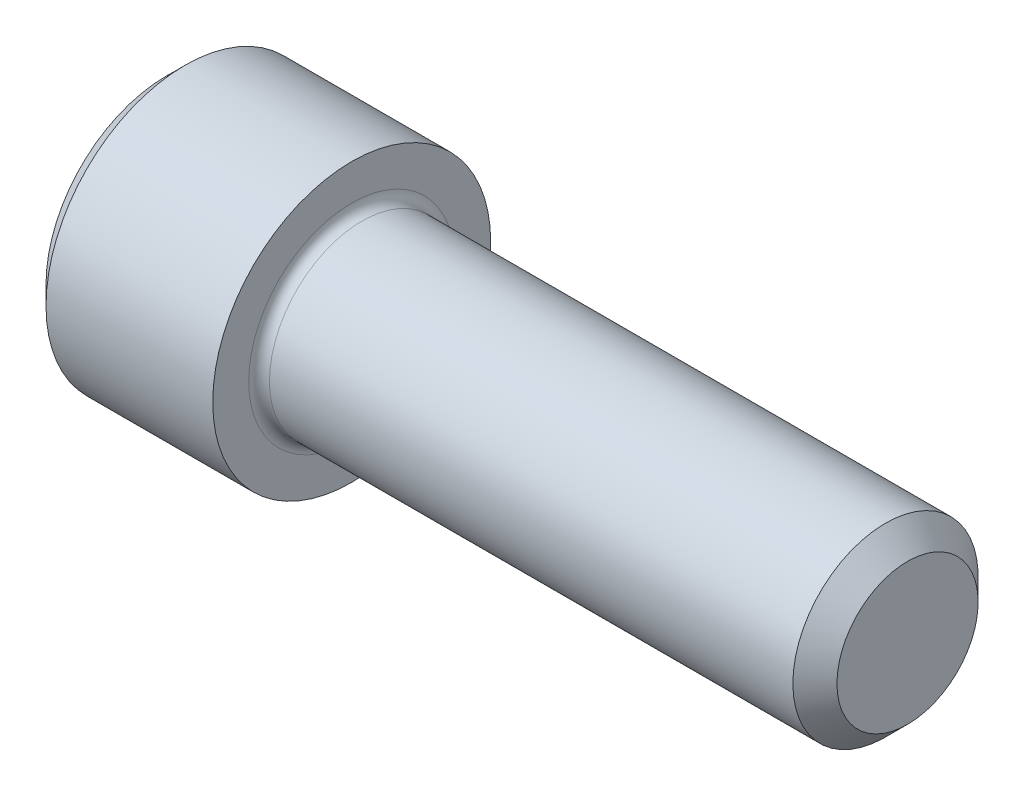
ISO-10303-21;
HEADER;
FILE_DESCRIPTION(('STEP AP214'),'2;1');
FILE_NAME('part.step','',(''),(''),'','','');
FILE_SCHEMA(('AUTOMOTIVE_DESIGN { 1 0 10303 214 1 1 1 1 }'));
ENDSEC;
DATA;
#1=APPLICATION_CONTEXT('core data for automotive mechanical design processes');
#2=APPLICATION_PROTOCOL_DEFINITION('international standard','automotive_design',2000,#1);
#3=PRODUCT_CONTEXT('',#1,'mechanical');
#4=PRODUCT('Part','Part','',(#3));
#5=PRODUCT_RELATED_PRODUCT_CATEGORY('part','',(#4));
#6=PRODUCT_DEFINITION_FORMATION('','',#4);
#7=PRODUCT_DEFINITION_CONTEXT('part definition',#1,'design');
#8=PRODUCT_DEFINITION('design','',#6,#7);
#9=PRODUCT_DEFINITION_SHAPE('','',#8);
#10=(LENGTH_UNIT() NAMED_UNIT(*) SI_UNIT(.MILLI.,.METRE.));
#11=(NAMED_UNIT(*) PLANE_ANGLE_UNIT() SI_UNIT($,.RADIAN.));
#12=(NAMED_UNIT(*) SI_UNIT($,.STERADIAN.) SOLID_ANGLE_UNIT());
#13=UNCERTAINTY_MEASURE_WITH_UNIT(LENGTH_MEASURE(1.E-05),#10,'distance_accuracy_value','');
#14=(GEOMETRIC_REPRESENTATION_CONTEXT(3) GLOBAL_UNCERTAINTY_ASSIGNED_CONTEXT((#13)) GLOBAL_UNIT_ASSIGNED_CONTEXT((#10,
#11,#12)) REPRESENTATION_CONTEXT('',''));
#15=CARTESIAN_POINT('',(0.,0.,0.));
#16=DIRECTION('',(0.,0.,1.));
#17=DIRECTION('',(1.,0.,0.));
#18=AXIS2_PLACEMENT_3D('',#15,#16,#17);
#19=CARTESIAN_POINT('',(0.,0.,0.));
#20=DIRECTION('',(-1.,0.,0.));
#21=DIRECTION('',(0.,0.,1.));
#22=AXIS2_PLACEMENT_3D('',#19,#20,#21);
#23=PLANE('',#22);
#24=DIRECTION('',(0.,-0.499999999999998,0.86602540378444));
#25=VECTOR('',#24,1.);
#26=CARTESIAN_POINT('',(0.,2.7496306570156,0.));
#27=LINE('',#26,#25);
#28=CARTESIAN_POINT('',(0.,2.7496306570156,0.));
#29=VERTEX_POINT('',#28);
#30=CARTESIAN_POINT('',(0.,1.37481532850781,2.38125));
#31=VERTEX_POINT('',#30);
#32=EDGE_CURVE('E374',#29,#31,#27,.T.);
#33=ORIENTED_EDGE('',*,*,#32,.T.);
#34=DIRECTION('',(0.,1.,0.));
#35=VECTOR('',#34,1.);
#36=CARTESIAN_POINT('',(0.,-1.37481532850779,2.38125));
#37=LINE('',#36,#35);
#38=CARTESIAN_POINT('',(0.,-1.37481532850779,2.38125));
#39=VERTEX_POINT('',#38);
#40=EDGE_CURVE('E122',#39,#31,#37,.T.);
#41=ORIENTED_EDGE('',*,*,#40,.F.);
#42=DIRECTION('',(0.,-0.500000000000001,-0.866025403784438));
#43=VECTOR('',#42,1.);
#44=CARTESIAN_POINT('',(0.,-1.37481532850779,2.38125));
#45=LINE('',#44,#43);
#46=CARTESIAN_POINT('',(0.,-2.74963065701559,0.));
#47=VERTEX_POINT('',#46);
#48=EDGE_CURVE('E377',#39,#47,#45,.T.);
#49=ORIENTED_EDGE('',*,*,#48,.T.);
#50=DIRECTION('',(0.,0.499999999999998,-0.86602540378444));
#51=VECTOR('',#50,1.);
#52=CARTESIAN_POINT('',(0.,-2.74963065701559,0.));
#53=LINE('',#52,#51);
#54=CARTESIAN_POINT('',(0.,-1.37481532850779,-2.38125));
#55=VERTEX_POINT('',#54);
#56=EDGE_CURVE('E380',#47,#55,#53,.T.);
#57=ORIENTED_EDGE('',*,*,#56,.T.);
#58=DIRECTION('',(0.,-1.,0.));
#59=VECTOR('',#58,1.);
#60=CARTESIAN_POINT('',(0.,1.3748153285078,-2.38125));
#61=LINE('',#60,#59);
#62=CARTESIAN_POINT('',(0.,1.3748153285078,-2.38125));
#63=VERTEX_POINT('',#62);
#64=EDGE_CURVE('E383',#63,#55,#61,.T.);
#65=ORIENTED_EDGE('',*,*,#64,.F.);
#66=DIRECTION('',(0.,-0.500000000000001,-0.866025403784438));
#67=VECTOR('',#66,1.);
#68=CARTESIAN_POINT('',(0.,2.7496306570156,0.));
#69=LINE('',#68,#67);
#70=EDGE_CURVE('E117',#29,#63,#69,.T.);
#71=ORIENTED_EDGE('',*,*,#70,.F.);
#72=EDGE_LOOP('',(#33,#41,#49,#57,#65,#71));
#73=FACE_BOUND('',#72,.T.);
#74=CARTESIAN_POINT('',(0.,0.,0.));
#75=DIRECTION('',(-1.,0.,0.));
#76=DIRECTION('',(0.,0.,1.));
#77=AXIS2_PLACEMENT_3D('',#74,#75,#76);
#78=CIRCLE('',#77,4.1275);
#79=CARTESIAN_POINT('',(0.,0.,4.1275));
#80=VERTEX_POINT('',#79);
#81=EDGE_CURVE('E133',#80,#80,#78,.T.);
#82=ORIENTED_EDGE('',*,*,#81,.T.);
#83=EDGE_LOOP('',(#82));
#84=FACE_BOUND('',#83,.T.);
#85=ADVANCED_FACE('F30',(#73,#84),#23,.T.);
#86=CARTESIAN_POINT('',(25.4,2.41935,0.));
#87=DIRECTION('',(1.,0.,0.));
#88=DIRECTION('',(0.,0.,-1.));
#89=AXIS2_PLACEMENT_3D('',#86,#87,#88);
#90=PLANE('',#89);
#91=CARTESIAN_POINT('',(25.4,0.,0.));
#92=DIRECTION('',(-1.,0.,0.));
#93=DIRECTION('',(0.,0.,1.));
#94=AXIS2_PLACEMENT_3D('',#91,#92,#93);
#95=CIRCLE('',#94,2.41935);
#96=CARTESIAN_POINT('',(25.4,0.,2.41935));
#97=VERTEX_POINT('',#96);
#98=EDGE_CURVE('E146',#97,#97,#95,.T.);
#99=ORIENTED_EDGE('',*,*,#98,.F.);
#100=EDGE_LOOP('',(#99));
#101=FACE_BOUND('',#100,.T.);
#102=ADVANCED_FACE('F167',(#101),#90,.T.);
#103=CARTESIAN_POINT('',(25.4,0.,0.));
#104=DIRECTION('',(-1.,0.,0.));
#105=DIRECTION('',(0.,0.,1.));
#106=AXIS2_PLACEMENT_3D('',#103,#104,#105);
#107=CONICAL_SURFACE('',#106,2.41935,0.785398163397433);
#108=CARTESIAN_POINT('',(24.64435,0.,0.));
#109=DIRECTION('',(-1.,0.,0.));
#110=DIRECTION('',(0.,0.,1.));
#111=AXIS2_PLACEMENT_3D('',#108,#109,#110);
#112=CIRCLE('',#111,3.17499999999999);
#113=CARTESIAN_POINT('',(24.64435,0.,3.17499999999999));
#114=VERTEX_POINT('',#113);
#115=EDGE_CURVE('E143',#114,#114,#112,.T.);
#116=ORIENTED_EDGE('',*,*,#115,.F.);
#117=EDGE_LOOP('',(#116));
#118=FACE_BOUND('',#117,.T.);
#119=ORIENTED_EDGE('',*,*,#98,.T.);
#120=EDGE_LOOP('',(#119));
#121=FACE_BOUND('',#120,.T.);
#122=ADVANCED_FACE('F173',(#118,#121),#107,.T.);
#123=CARTESIAN_POINT('',(-31.75,0.,0.));
#124=DIRECTION('',(-1.,0.,0.));
#125=DIRECTION('',(0.,0.,1.));
#126=AXIS2_PLACEMENT_3D('',#123,#124,#125);
#127=CYLINDRICAL_SURFACE('',#126,3.17499999999999);
#128=CARTESIAN_POINT('',(6.70560000000001,0.,0.));
#129=DIRECTION('',(1.,0.,0.));
#130=DIRECTION('',(0.,0.,-1.));
#131=AXIS2_PLACEMENT_3D('',#128,#129,#130);
#132=CIRCLE('',#131,3.17499999999999);
#133=CARTESIAN_POINT('',(6.70560000000001,0.,-3.17499999999999));
#134=VERTEX_POINT('',#133);
#135=EDGE_CURVE('E11',#134,#134,#132,.T.);
#136=ORIENTED_EDGE('',*,*,#135,.T.);
#137=EDGE_LOOP('',(#136));
#138=FACE_BOUND('',#137,.T.);
#139=ORIENTED_EDGE('',*,*,#115,.T.);
#140=EDGE_LOOP('',(#139));
#141=FACE_BOUND('',#140,.T.);
#142=ADVANCED_FACE('F184',(#138,#141),#127,.T.);
#143=CARTESIAN_POINT('',(6.35,4.7625,0.));
#144=DIRECTION('',(1.,0.,0.));
#145=DIRECTION('',(0.,0.,-1.));
#146=AXIS2_PLACEMENT_3D('',#143,#144,#145);
#147=PLANE('',#146);
#148=CARTESIAN_POINT('',(6.35,0.,0.));
#149=DIRECTION('',(1.,0.,0.));
#150=DIRECTION('',(0.,0.,-1.));
#151=AXIS2_PLACEMENT_3D('',#148,#149,#150);
#152=CIRCLE('',#151,3.53059999999999);
#153=CARTESIAN_POINT('',(6.35,0.,-3.53059999999999));
#154=VERTEX_POINT('',#153);
#155=EDGE_CURVE('E38',#154,#154,#152,.F.);
#156=ORIENTED_EDGE('',*,*,#155,.T.);
#157=EDGE_LOOP('',(#156));
#158=FACE_BOUND('',#157,.T.);
#159=CARTESIAN_POINT('',(6.35,0.,0.));
#160=DIRECTION('',(-1.,0.,0.));
#161=DIRECTION('',(0.,0.,1.));
#162=AXIS2_PLACEMENT_3D('',#159,#160,#161);
#163=CIRCLE('',#162,4.7625);
#164=CARTESIAN_POINT('',(6.35,0.,4.7625));
#165=VERTEX_POINT('',#164);
#166=EDGE_CURVE('E140',#165,#165,#163,.T.);
#167=ORIENTED_EDGE('',*,*,#166,.F.);
#168=EDGE_LOOP('',(#167));
#169=FACE_BOUND('',#168,.T.);
#170=ADVANCED_FACE('F151',(#158,#169),#147,.T.);
#171=CARTESIAN_POINT('',(-31.75,0.,0.));
#172=DIRECTION('',(-1.,0.,0.));
#173=DIRECTION('',(0.,0.,1.));
#174=AXIS2_PLACEMENT_3D('',#171,#172,#173);
#175=CYLINDRICAL_SURFACE('',#174,4.7625);
#176=ORIENTED_EDGE('',*,*,#166,.T.);
#177=EDGE_LOOP('',(#176));
#178=FACE_BOUND('',#177,.T.);
#179=CARTESIAN_POINT('',(0.635000000000004,0.,0.));
#180=DIRECTION('',(-1.,0.,0.));
#181=DIRECTION('',(0.,0.,1.));
#182=AXIS2_PLACEMENT_3D('',#179,#180,#181);
#183=CIRCLE('',#182,4.7625);
#184=CARTESIAN_POINT('',(0.635000000000004,0.,4.7625));
#185=VERTEX_POINT('',#184);
#186=EDGE_CURVE('E137',#185,#185,#183,.T.);
#187=ORIENTED_EDGE('',*,*,#186,.F.);
#188=EDGE_LOOP('',(#187));
#189=FACE_BOUND('',#188,.T.);
#190=ADVANCED_FACE('F162',(#178,#189),#175,.T.);
#191=CARTESIAN_POINT('',(0.,0.,0.));
#192=DIRECTION('',(1.,0.,0.));
#193=DIRECTION('',(0.,0.,-1.));
#194=AXIS2_PLACEMENT_3D('',#191,#192,#193);
#195=CONICAL_SURFACE('',#194,4.1275,0.785398163397442);
#196=ORIENTED_EDGE('',*,*,#186,.T.);
#197=EDGE_LOOP('',(#196));
#198=FACE_BOUND('',#197,.T.);
#199=ORIENTED_EDGE('',*,*,#81,.F.);
#200=EDGE_LOOP('',(#199));
#201=FACE_BOUND('',#200,.T.);
#202=ADVANCED_FACE('F155',(#198,#201),#195,.T.);
#203=CARTESIAN_POINT('',(6.70560000000001,0.,0.));
#204=DIRECTION('',(1.,0.,0.));
#205=DIRECTION('',(0.,0.,-1.));
#206=AXIS2_PLACEMENT_3D('',#203,#204,#205);
#207=TOROIDAL_SURFACE('',#206,3.53059999999999,0.3556);
#208=ORIENTED_EDGE('',*,*,#135,.F.);
#209=EDGE_LOOP('',(#208));
#210=FACE_BOUND('',#209,.T.);
#211=ORIENTED_EDGE('',*,*,#155,.F.);
#212=EDGE_LOOP('',(#211));
#213=FACE_BOUND('',#212,.T.);
#214=ADVANCED_FACE('F32',(#210,#213),#207,.F.);
#215=CARTESIAN_POINT('',(3.048,2.7496306570156,0.));
#216=DIRECTION('',(0.,-0.86602540378444,-0.499999999999998));
#217=DIRECTION('',(0.,0.499999999999998,-0.86602540378444));
#218=AXIS2_PLACEMENT_3D('',#215,#216,#217);
#219=PLANE('',#218);
#220=ORIENTED_EDGE('',*,*,#32,.F.);
#221=DIRECTION('',(-1.,0.,0.));
#222=VECTOR('',#221,1.);
#223=CARTESIAN_POINT('',(3.048,2.7496306570156,0.));
#224=LINE('',#223,#222);
#225=CARTESIAN_POINT('',(3.048,2.7496306570156,0.));
#226=VERTEX_POINT('',#225);
#227=EDGE_CURVE('E373',#226,#29,#224,.T.);
#228=ORIENTED_EDGE('',*,*,#227,.F.);
#229=DIRECTION('',(0.,-0.499999999999998,0.86602540378444));
#230=VECTOR('',#229,1.);
#231=CARTESIAN_POINT('',(3.048,2.7496306570156,0.));
#232=LINE('',#231,#230);
#233=CARTESIAN_POINT('',(3.048,2.0622229927617,1.190625));
#234=VERTEX_POINT('',#233);
#235=EDGE_CURVE('E45',#226,#234,#232,.T.);
#236=ORIENTED_EDGE('',*,*,#235,.T.);
#237=CARTESIAN_POINT('',(3.048,1.37481532850781,2.38125));
#238=VERTEX_POINT('',#237);
#239=EDGE_CURVE('E103',#234,#238,#232,.T.);
#240=ORIENTED_EDGE('',*,*,#239,.T.);
#241=DIRECTION('',(-1.,0.,0.));
#242=VECTOR('',#241,1.);
#243=CARTESIAN_POINT('',(3.048,1.37481532850781,2.38125));
#244=LINE('',#243,#242);
#245=EDGE_CURVE('E115',#238,#31,#244,.T.);
#246=ORIENTED_EDGE('',*,*,#245,.T.);
#247=EDGE_LOOP('',(#220,#228,#236,#240,#246));
#248=FACE_BOUND('',#247,.T.);
#249=ADVANCED_FACE('F114',(#248),#219,.T.);
#250=CARTESIAN_POINT('',(3.048,-1.37481532850779,2.38125));
#251=DIRECTION('',(0.,0.,1.));
#252=DIRECTION('',(0.,-1.,0.));
#253=AXIS2_PLACEMENT_3D('',#250,#251,#252);
#254=PLANE('',#253);
#255=ORIENTED_EDGE('',*,*,#40,.T.);
#256=ORIENTED_EDGE('',*,*,#245,.F.);
#257=DIRECTION('',(0.,1.,0.));
#258=VECTOR('',#257,1.);
#259=CARTESIAN_POINT('',(3.048,-1.37481532850779,2.38125));
#260=LINE('',#259,#258);
#261=CARTESIAN_POINT('',(3.048,0.,2.38125));
#262=VERTEX_POINT('',#261);
#263=EDGE_CURVE('E101',#262,#238,#260,.T.);
#264=ORIENTED_EDGE('',*,*,#263,.F.);
#265=CARTESIAN_POINT('',(3.048,-1.37481532850779,2.38125));
#266=VERTEX_POINT('',#265);
#267=EDGE_CURVE('E111',#266,#262,#260,.T.);
#268=ORIENTED_EDGE('',*,*,#267,.F.);
#269=DIRECTION('',(-1.,0.,0.));
#270=VECTOR('',#269,1.);
#271=CARTESIAN_POINT('',(3.048,-1.37481532850779,2.38125));
#272=LINE('',#271,#270);
#273=EDGE_CURVE('E124',#266,#39,#272,.T.);
#274=ORIENTED_EDGE('',*,*,#273,.T.);
#275=EDGE_LOOP('',(#255,#256,#264,#268,#274));
#276=FACE_BOUND('',#275,.T.);
#277=ADVANCED_FACE('F119',(#276),#254,.F.);
#278=CARTESIAN_POINT('',(3.048,-1.37481532850779,2.38125));
#279=DIRECTION('',(0.,0.866025403784438,-0.500000000000001));
#280=DIRECTION('',(0.,0.500000000000001,0.866025403784438));
#281=AXIS2_PLACEMENT_3D('',#278,#279,#280);
#282=PLANE('',#281);
#283=ORIENTED_EDGE('',*,*,#48,.F.);
#284=ORIENTED_EDGE('',*,*,#273,.F.);
#285=DIRECTION('',(0.,-0.500000000000001,-0.866025403784438));
#286=VECTOR('',#285,1.);
#287=CARTESIAN_POINT('',(3.048,-1.37481532850779,2.38125));
#288=LINE('',#287,#286);
#289=CARTESIAN_POINT('',(3.048,-2.06222299276169,1.190625));
#290=VERTEX_POINT('',#289);
#291=EDGE_CURVE('E354',#266,#290,#288,.T.);
#292=ORIENTED_EDGE('',*,*,#291,.T.);
#293=CARTESIAN_POINT('',(3.048,-2.74963065701559,0.));
#294=VERTEX_POINT('',#293);
#295=EDGE_CURVE('E356',#290,#294,#288,.T.);
#296=ORIENTED_EDGE('',*,*,#295,.T.);
#297=DIRECTION('',(-1.,0.,0.));
#298=VECTOR('',#297,1.);
#299=CARTESIAN_POINT('',(3.048,-2.74963065701559,0.));
#300=LINE('',#299,#298);
#301=EDGE_CURVE('E129',#294,#47,#300,.T.);
#302=ORIENTED_EDGE('',*,*,#301,.T.);
#303=EDGE_LOOP('',(#283,#284,#292,#296,#302));
#304=FACE_BOUND('',#303,.T.);
#305=ADVANCED_FACE('F246',(#304),#282,.T.);
#306=CARTESIAN_POINT('',(3.048,-2.74963065701559,0.));
#307=DIRECTION('',(0.,0.86602540378444,0.499999999999998));
#308=DIRECTION('',(0.,-0.499999999999998,0.86602540378444));
#309=AXIS2_PLACEMENT_3D('',#306,#307,#308);
#310=PLANE('',#309);
#311=ORIENTED_EDGE('',*,*,#56,.F.);
#312=ORIENTED_EDGE('',*,*,#301,.F.);
#313=DIRECTION('',(0.,0.499999999999998,-0.86602540378444));
#314=VECTOR('',#313,1.);
#315=CARTESIAN_POINT('',(3.048,-2.74963065701559,0.));
#316=LINE('',#315,#314);
#317=CARTESIAN_POINT('',(3.048,-2.06222299276169,-1.19062499999999));
#318=VERTEX_POINT('',#317);
#319=EDGE_CURVE('E359',#294,#318,#316,.T.);
#320=ORIENTED_EDGE('',*,*,#319,.T.);
#321=CARTESIAN_POINT('',(3.048,-1.37481532850779,-2.38125));
#322=VERTEX_POINT('',#321);
#323=EDGE_CURVE('E363',#318,#322,#316,.T.);
#324=ORIENTED_EDGE('',*,*,#323,.T.);
#325=DIRECTION('',(-1.,0.,0.));
#326=VECTOR('',#325,1.);
#327=CARTESIAN_POINT('',(3.048,-1.37481532850779,-2.38125));
#328=LINE('',#327,#326);
#329=EDGE_CURVE('E392',#322,#55,#328,.T.);
#330=ORIENTED_EDGE('',*,*,#329,.T.);
#331=EDGE_LOOP('',(#311,#312,#320,#324,#330));
#332=FACE_BOUND('',#331,.T.);
#333=ADVANCED_FACE('F254',(#332),#310,.T.);
#334=CARTESIAN_POINT('',(3.048,1.3748153285078,-2.38125));
#335=DIRECTION('',(0.,0.,-1.));
#336=DIRECTION('',(0.,1.,0.));
#337=AXIS2_PLACEMENT_3D('',#334,#335,#336);
#338=PLANE('',#337);
#339=ORIENTED_EDGE('',*,*,#64,.T.);
#340=ORIENTED_EDGE('',*,*,#329,.F.);
#341=DIRECTION('',(0.,-1.,0.));
#342=VECTOR('',#341,1.);
#343=CARTESIAN_POINT('',(3.048,1.3748153285078,-2.38125));
#344=LINE('',#343,#342);
#345=CARTESIAN_POINT('',(3.048,0.,-2.38125));
#346=VERTEX_POINT('',#345);
#347=EDGE_CURVE('E367',#346,#322,#344,.T.);
#348=ORIENTED_EDGE('',*,*,#347,.F.);
#349=CARTESIAN_POINT('',(3.048,1.3748153285078,-2.38125));
#350=VERTEX_POINT('',#349);
#351=EDGE_CURVE('E368',#350,#346,#344,.T.);
#352=ORIENTED_EDGE('',*,*,#351,.F.);
#353=DIRECTION('',(-1.,0.,0.));
#354=VECTOR('',#353,1.);
#355=CARTESIAN_POINT('',(3.048,1.3748153285078,-2.38125));
#356=LINE('',#355,#354);
#357=EDGE_CURVE('E389',#350,#63,#356,.T.);
#358=ORIENTED_EDGE('',*,*,#357,.T.);
#359=EDGE_LOOP('',(#339,#340,#348,#352,#358));
#360=FACE_BOUND('',#359,.T.);
#361=ADVANCED_FACE('F263',(#360),#338,.F.);
#362=CARTESIAN_POINT('',(3.048,2.7496306570156,0.));
#363=DIRECTION('',(0.,0.866025403784438,-0.500000000000001));
#364=DIRECTION('',(0.,0.500000000000001,0.866025403784438));
#365=AXIS2_PLACEMENT_3D('',#362,#363,#364);
#366=PLANE('',#365);
#367=ORIENTED_EDGE('',*,*,#70,.T.);
#368=ORIENTED_EDGE('',*,*,#357,.F.);
#369=DIRECTION('',(0.,-0.500000000000001,-0.866025403784438));
#370=VECTOR('',#369,1.);
#371=CARTESIAN_POINT('',(3.048,2.7496306570156,0.));
#372=LINE('',#371,#370);
#373=CARTESIAN_POINT('',(3.048,2.0622229927617,-1.19062500000001));
#374=VERTEX_POINT('',#373);
#375=EDGE_CURVE('E371',#374,#350,#372,.T.);
#376=ORIENTED_EDGE('',*,*,#375,.F.);
#377=EDGE_CURVE('E345',#226,#374,#372,.T.);
#378=ORIENTED_EDGE('',*,*,#377,.F.);
#379=ORIENTED_EDGE('',*,*,#227,.T.);
#380=EDGE_LOOP('',(#367,#368,#376,#378,#379));
#381=FACE_BOUND('',#380,.T.);
#382=ADVANCED_FACE('F272',(#381),#366,.F.);
#383=CARTESIAN_POINT('',(3.048,1.37481532850781,2.38125));
#384=DIRECTION('',(-1.,0.,0.));
#385=DIRECTION('',(0.,0.,1.));
#386=AXIS2_PLACEMENT_3D('',#383,#384,#385);
#387=PLANE('',#386);
#388=CARTESIAN_POINT('',(3.048,0.,0.));
#389=DIRECTION('',(-1.,0.,0.));
#390=DIRECTION('',(0.,0.,1.));
#391=AXIS2_PLACEMENT_3D('',#388,#389,#390);
#392=CIRCLE('',#391,2.38125);
#393=EDGE_CURVE('E123',#290,#262,#392,.T.);
#394=ORIENTED_EDGE('',*,*,#393,.F.);
#395=ORIENTED_EDGE('',*,*,#291,.F.);
#396=ORIENTED_EDGE('',*,*,#267,.T.);
#397=EDGE_LOOP('',(#394,#395,#396));
#398=FACE_BOUND('',#397,.T.);
#399=ADVANCED_FACE('F281',(#398),#387,.T.);
#400=EDGE_CURVE('E127',#318,#290,#392,.T.);
#401=ORIENTED_EDGE('',*,*,#400,.F.);
#402=ORIENTED_EDGE('',*,*,#319,.F.);
#403=ORIENTED_EDGE('',*,*,#295,.F.);
#404=EDGE_LOOP('',(#401,#402,#403));
#405=FACE_BOUND('',#404,.T.);
#406=ADVANCED_FACE('F290',(#405),#387,.T.);
#407=EDGE_CURVE('E398',#346,#318,#392,.T.);
#408=ORIENTED_EDGE('',*,*,#407,.F.);
#409=ORIENTED_EDGE('',*,*,#347,.T.);
#410=ORIENTED_EDGE('',*,*,#323,.F.);
#411=EDGE_LOOP('',(#408,#409,#410));
#412=FACE_BOUND('',#411,.T.);
#413=ADVANCED_FACE('F299',(#412),#387,.T.);
#414=EDGE_CURVE('E348',#374,#346,#392,.T.);
#415=ORIENTED_EDGE('',*,*,#414,.F.);
#416=ORIENTED_EDGE('',*,*,#375,.T.);
#417=ORIENTED_EDGE('',*,*,#351,.T.);
#418=EDGE_LOOP('',(#415,#416,#417));
#419=FACE_BOUND('',#418,.T.);
#420=ADVANCED_FACE('F307',(#419),#387,.T.);
#421=EDGE_CURVE('E134',#234,#374,#392,.T.);
#422=ORIENTED_EDGE('',*,*,#421,.F.);
#423=ORIENTED_EDGE('',*,*,#235,.F.);
#424=ORIENTED_EDGE('',*,*,#377,.T.);
#425=EDGE_LOOP('',(#422,#423,#424));
#426=FACE_BOUND('',#425,.T.);
#427=ADVANCED_FACE('F315',(#426),#387,.T.);
#428=EDGE_CURVE('E106',#262,#234,#392,.T.);
#429=ORIENTED_EDGE('',*,*,#428,.F.);
#430=ORIENTED_EDGE('',*,*,#263,.T.);
#431=ORIENTED_EDGE('',*,*,#239,.F.);
#432=EDGE_LOOP('',(#429,#430,#431));
#433=FACE_BOUND('',#432,.T.);
#434=ADVANCED_FACE('F102',(#433),#387,.T.);
#435=CARTESIAN_POINT('',(3.048,0.,0.));
#436=DIRECTION('',(-1.,0.,0.));
#437=DIRECTION('',(0.,0.,1.));
#438=AXIS2_PLACEMENT_3D('',#435,#436,#437);
#439=CONICAL_SURFACE('',#438,2.38125,1.04719755119659);
#440=CARTESIAN_POINT('',(4.42281532850781,0.,0.));
#441=VERTEX_POINT('',#440);
#442=VERTEX_LOOP('',#441);
#443=FACE_BOUND('',#442,.T.);
#444=ORIENTED_EDGE('',*,*,#428,.T.);
#445=ORIENTED_EDGE('',*,*,#421,.T.);
#446=ORIENTED_EDGE('',*,*,#414,.T.);
#447=ORIENTED_EDGE('',*,*,#407,.T.);
#448=ORIENTED_EDGE('',*,*,#400,.T.);
#449=ORIENTED_EDGE('',*,*,#393,.T.);
#450=EDGE_LOOP('',(#444,#445,#446,#447,#448,#449));
#451=FACE_BOUND('',#450,.T.);
#452=ADVANCED_FACE('F177',(#443,#451),#439,.F.);
#453=CLOSED_SHELL('',(#85,#102,#122,#142,#170,#190,#202,#214,#249,#277,#305,#333,#361,#382,#399,
#406,#413,#420,#427,#434,#452));
#454=MANIFOLD_SOLID_BREP('B2',#453);
#455=ADVANCED_BREP_SHAPE_REPRESENTATION('',(#18,#454),#14);
#456=SHAPE_DEFINITION_REPRESENTATION(#9,#455);
ENDSEC;
END-ISO-10303-21;
